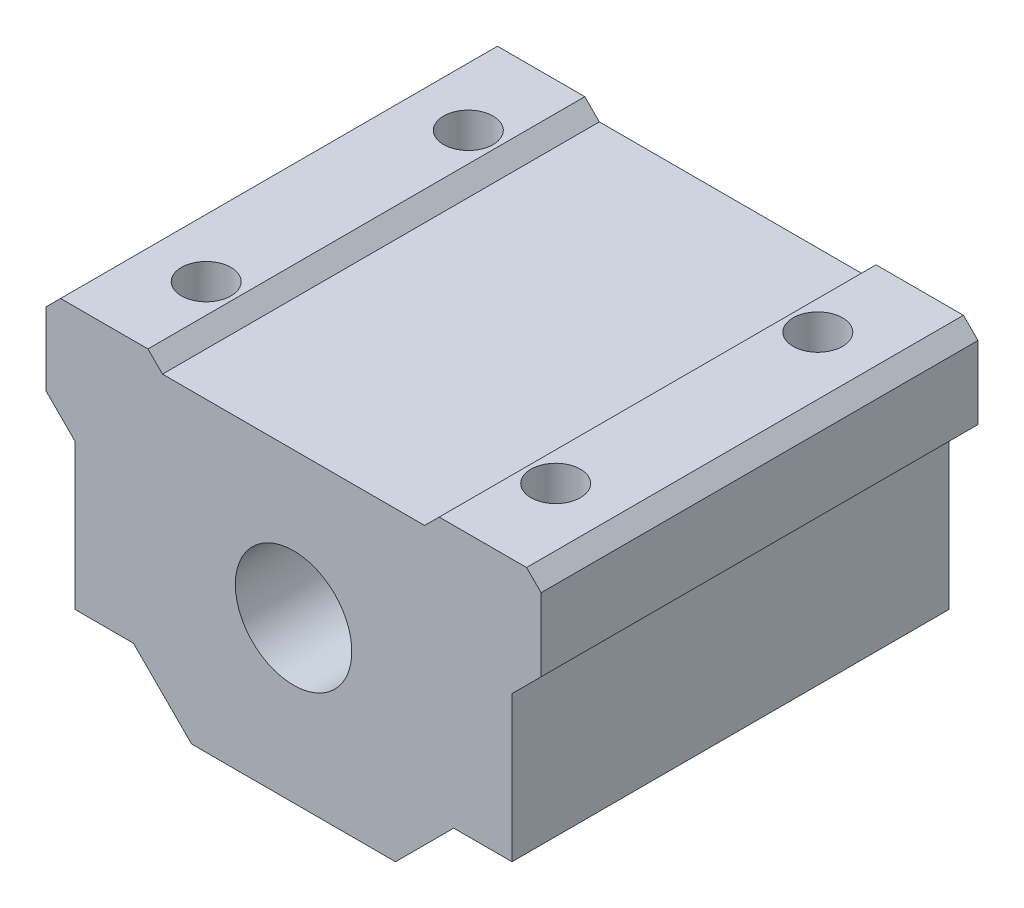
ISO-10303-21;
HEADER;
FILE_DESCRIPTION(('STEP AP214'),'2;1');
FILE_NAME('part.step','',(''),(''),'','','');
FILE_SCHEMA(('AUTOMOTIVE_DESIGN { 1 0 10303 214 1 1 1 1 }'));
ENDSEC;
DATA;
#1=APPLICATION_CONTEXT('core data for automotive mechanical design processes');
#2=APPLICATION_PROTOCOL_DEFINITION('international standard','automotive_design',2000,#1);
#3=PRODUCT_CONTEXT('',#1,'mechanical');
#4=PRODUCT('Part','Part','',(#3));
#5=PRODUCT_RELATED_PRODUCT_CATEGORY('part','',(#4));
#6=PRODUCT_DEFINITION_FORMATION('','',#4);
#7=PRODUCT_DEFINITION_CONTEXT('part definition',#1,'design');
#8=PRODUCT_DEFINITION('design','',#6,#7);
#9=PRODUCT_DEFINITION_SHAPE('','',#8);
#10=(LENGTH_UNIT() NAMED_UNIT(*) SI_UNIT(.MILLI.,.METRE.));
#11=(NAMED_UNIT(*) PLANE_ANGLE_UNIT() SI_UNIT($,.RADIAN.));
#12=(NAMED_UNIT(*) SI_UNIT($,.STERADIAN.) SOLID_ANGLE_UNIT());
#13=UNCERTAINTY_MEASURE_WITH_UNIT(LENGTH_MEASURE(1.E-05),#10,'distance_accuracy_value','');
#14=(GEOMETRIC_REPRESENTATION_CONTEXT(3) GLOBAL_UNCERTAINTY_ASSIGNED_CONTEXT((#13)) GLOBAL_UNIT_ASSIGNED_CONTEXT((#10,
#11,#12)) REPRESENTATION_CONTEXT('',''));
#15=CARTESIAN_POINT('',(0.,0.,0.));
#16=DIRECTION('',(0.,0.,1.));
#17=DIRECTION('',(1.,0.,0.));
#18=AXIS2_PLACEMENT_3D('',#15,#16,#17);
#19=CARTESIAN_POINT('',(0.,0.,30.));
#20=DIRECTION('',(0.,0.,1.));
#21=DIRECTION('',(1.,0.,0.));
#22=AXIS2_PLACEMENT_3D('',#19,#20,#21);
#23=PLANE('',#22);
#24=DIRECTION('',(0.707106781186548,0.707106781186549,0.));
#25=VECTOR('',#24,1.);
#26=CARTESIAN_POINT('',(6.99999999999992,0.,30.0000000000001));
#27=LINE('',#26,#25);
#28=CARTESIAN_POINT('',(6.99999999999992,0.,30.0000000000001));
#29=VERTEX_POINT('',#28);
#30=CARTESIAN_POINT('',(10.9999999999999,4.00000000000002,30.0000000000001));
#31=VERTEX_POINT('',#30);
#32=EDGE_CURVE('E247',#29,#31,#27,.T.);
#33=ORIENTED_EDGE('',*,*,#32,.T.);
#34=DIRECTION('',(1.,0.,0.));
#35=VECTOR('',#34,1.);
#36=CARTESIAN_POINT('',(10.9999999999999,4.00000000000002,30.0000000000001));
#37=LINE('',#36,#35);
#38=CARTESIAN_POINT('',(14.9999999999999,4.00000000000007,30.));
#39=VERTEX_POINT('',#38);
#40=EDGE_CURVE('E347',#31,#39,#37,.T.);
#41=ORIENTED_EDGE('',*,*,#40,.T.);
#42=DIRECTION('',(0.,1.,0.));
#43=VECTOR('',#42,1.);
#44=CARTESIAN_POINT('',(14.9999999999999,4.00000000000007,30.));
#45=LINE('',#44,#43);
#46=CARTESIAN_POINT('',(14.9999999999999,14.0000000000001,30.0000000000001));
#47=VERTEX_POINT('',#46);
#48=EDGE_CURVE('E344',#39,#47,#45,.T.);
#49=ORIENTED_EDGE('',*,*,#48,.T.);
#50=DIRECTION('',(0.70710678118655,0.707106781186546,0.));
#51=VECTOR('',#50,1.);
#52=CARTESIAN_POINT('',(14.9999999999999,14.0000000000001,30.0000000000001));
#53=LINE('',#52,#51);
#54=CARTESIAN_POINT('',(16.9999999999999,16.0000000000001,30.0000000000001));
#55=VERTEX_POINT('',#54);
#56=EDGE_CURVE('E341',#47,#55,#53,.T.);
#57=ORIENTED_EDGE('',*,*,#56,.T.);
#58=DIRECTION('',(0.,1.,0.));
#59=VECTOR('',#58,1.);
#60=CARTESIAN_POINT('',(16.9999999999999,16.0000000000001,30.0000000000001));
#61=LINE('',#60,#59);
#62=CARTESIAN_POINT('',(16.9999999999999,21.,30.0000000000001));
#63=VERTEX_POINT('',#62);
#64=EDGE_CURVE('E338',#55,#63,#61,.T.);
#65=ORIENTED_EDGE('',*,*,#64,.T.);
#66=DIRECTION('',(-0.707106781186549,0.707106781186548,0.));
#67=VECTOR('',#66,1.);
#68=CARTESIAN_POINT('',(16.9999999999999,21.,30.0000000000001));
#69=LINE('',#68,#67);
#70=CARTESIAN_POINT('',(15.9999999999999,22.,30.0000000000001));
#71=VERTEX_POINT('',#70);
#72=EDGE_CURVE('E335',#63,#71,#69,.T.);
#73=ORIENTED_EDGE('',*,*,#72,.T.);
#74=DIRECTION('',(-1.,0.,0.));
#75=VECTOR('',#74,1.);
#76=CARTESIAN_POINT('',(15.9999999999999,22.,30.0000000000001));
#77=LINE('',#76,#75);
#78=CARTESIAN_POINT('',(9.99999999999987,22.,30.0000000000001));
#79=VERTEX_POINT('',#78);
#80=EDGE_CURVE('E332',#71,#79,#77,.T.);
#81=ORIENTED_EDGE('',*,*,#80,.T.);
#82=DIRECTION('',(-0.707106781186544,-0.707106781186552,0.));
#83=VECTOR('',#82,1.);
#84=CARTESIAN_POINT('',(9.99999999999987,22.,30.0000000000001));
#85=LINE('',#84,#83);
#86=CARTESIAN_POINT('',(8.99999999999987,21.,30.0000000000001));
#87=VERTEX_POINT('',#86);
#88=EDGE_CURVE('E329',#79,#87,#85,.T.);
#89=ORIENTED_EDGE('',*,*,#88,.T.);
#90=DIRECTION('',(-1.,0.,0.));
#91=VECTOR('',#90,1.);
#92=CARTESIAN_POINT('',(8.99999999999987,21.,30.0000000000001));
#93=LINE('',#92,#91);
#94=CARTESIAN_POINT('',(-9.00000000000015,21.0000000000002,30.));
#95=VERTEX_POINT('',#94);
#96=EDGE_CURVE('E326',#87,#95,#93,.T.);
#97=ORIENTED_EDGE('',*,*,#96,.T.);
#98=DIRECTION('',(-0.707106781186547,0.70710678118655,0.));
#99=VECTOR('',#98,1.);
#100=CARTESIAN_POINT('',(-10.0000000000001,22.0000000000002,30.));
#101=LINE('',#100,#99);
#102=CARTESIAN_POINT('',(-10.0000000000001,22.0000000000002,30.));
#103=VERTEX_POINT('',#102);
#104=EDGE_CURVE('E323',#95,#103,#101,.T.);
#105=ORIENTED_EDGE('',*,*,#104,.T.);
#106=DIRECTION('',(-1.,0.,0.));
#107=VECTOR('',#106,1.);
#108=CARTESIAN_POINT('',(-16.0000000000002,22.0000000000002,30.));
#109=LINE('',#108,#107);
#110=CARTESIAN_POINT('',(-16.0000000000002,22.0000000000002,30.));
#111=VERTEX_POINT('',#110);
#112=EDGE_CURVE('E320',#103,#111,#109,.T.);
#113=ORIENTED_EDGE('',*,*,#112,.T.);
#114=DIRECTION('',(-0.707106781186549,-0.707106781186548,0.));
#115=VECTOR('',#114,1.);
#116=CARTESIAN_POINT('',(-17.0000000000002,21.0000000000002,30.));
#117=LINE('',#116,#115);
#118=CARTESIAN_POINT('',(-17.0000000000002,21.0000000000002,30.));
#119=VERTEX_POINT('',#118);
#120=EDGE_CURVE('E317',#111,#119,#117,.T.);
#121=ORIENTED_EDGE('',*,*,#120,.T.);
#122=DIRECTION('',(0.,-1.,0.));
#123=VECTOR('',#122,1.);
#124=CARTESIAN_POINT('',(-17.0000000000002,16.0000000000002,30.));
#125=LINE('',#124,#123);
#126=CARTESIAN_POINT('',(-17.0000000000002,16.0000000000002,30.));
#127=VERTEX_POINT('',#126);
#128=EDGE_CURVE('E314',#119,#127,#125,.T.);
#129=ORIENTED_EDGE('',*,*,#128,.T.);
#130=DIRECTION('',(0.70710678118655,-0.707106781186546,0.));
#131=VECTOR('',#130,1.);
#132=CARTESIAN_POINT('',(-15.0000000000001,14.0000000000002,30.));
#133=LINE('',#132,#131);
#134=CARTESIAN_POINT('',(-15.0000000000001,14.0000000000002,30.));
#135=VERTEX_POINT('',#134);
#136=EDGE_CURVE('E311',#127,#135,#133,.T.);
#137=ORIENTED_EDGE('',*,*,#136,.T.);
#138=DIRECTION('',(0.,-1.,0.));
#139=VECTOR('',#138,1.);
#140=CARTESIAN_POINT('',(-15.0000000000001,4.00000000000018,30.));
#141=LINE('',#140,#139);
#142=CARTESIAN_POINT('',(-15.0000000000001,4.00000000000018,30.));
#143=VERTEX_POINT('',#142);
#144=EDGE_CURVE('E308',#135,#143,#141,.T.);
#145=ORIENTED_EDGE('',*,*,#144,.T.);
#146=DIRECTION('',(1.,0.,0.));
#147=VECTOR('',#146,1.);
#148=CARTESIAN_POINT('',(-11.0000000000001,4.00000000000021,30.));
#149=LINE('',#148,#147);
#150=CARTESIAN_POINT('',(-11.0000000000001,4.00000000000021,30.));
#151=VERTEX_POINT('',#150);
#152=EDGE_CURVE('E305',#143,#151,#149,.T.);
#153=ORIENTED_EDGE('',*,*,#152,.T.);
#154=DIRECTION('',(0.707106781186548,-0.707106781186549,0.));
#155=VECTOR('',#154,1.);
#156=CARTESIAN_POINT('',(-7.00000000000009,0.,30.));
#157=LINE('',#156,#155);
#158=CARTESIAN_POINT('',(-7.00000000000009,0.,30.));
#159=VERTEX_POINT('',#158);
#160=EDGE_CURVE('E216',#151,#159,#157,.T.);
#161=ORIENTED_EDGE('',*,*,#160,.T.);
#162=DIRECTION('',(1.,0.,0.));
#163=VECTOR('',#162,1.);
#164=CARTESIAN_POINT('',(-7.00000000000009,0.,30.));
#165=LINE('',#164,#163);
#166=EDGE_CURVE('E241',#159,#29,#165,.T.);
#167=ORIENTED_EDGE('',*,*,#166,.T.);
#168=EDGE_LOOP('',(#33,#41,#49,#57,#65,#73,#81,#89,#97,#105,#113,#121,#129,#137,#145,#153,#161,#167));
#169=FACE_BOUND('',#168,.T.);
#170=CARTESIAN_POINT('',(0.,11.,30.));
#171=DIRECTION('',(0.,0.,1.));
#172=DIRECTION('',(-1.,0.,0.));
#173=AXIS2_PLACEMENT_3D('',#170,#171,#172);
#174=CIRCLE('',#173,4.);
#175=CARTESIAN_POINT('',(-4.0000000000001,11.,30.));
#176=VERTEX_POINT('',#175);
#177=EDGE_CURVE('E300',#176,#176,#174,.T.);
#178=ORIENTED_EDGE('',*,*,#177,.F.);
#179=EDGE_LOOP('',(#178));
#180=FACE_BOUND('',#179,.T.);
#181=ADVANCED_FACE('F40',(#169,#180),#23,.T.);
#182=CARTESIAN_POINT('',(0.,0.,0.));
#183=DIRECTION('',(0.,0.,1.));
#184=DIRECTION('',(1.,0.,0.));
#185=AXIS2_PLACEMENT_3D('',#182,#183,#184);
#186=PLANE('',#185);
#187=DIRECTION('',(0.707106781186548,0.707106781186549,0.));
#188=VECTOR('',#187,1.);
#189=CARTESIAN_POINT('',(7.00000000000001,0.,0.));
#190=LINE('',#189,#188);
#191=CARTESIAN_POINT('',(7.00000000000001,0.,0.));
#192=VERTEX_POINT('',#191);
#193=CARTESIAN_POINT('',(11.,4.,0.));
#194=VERTEX_POINT('',#193);
#195=EDGE_CURVE('E296',#192,#194,#190,.T.);
#196=ORIENTED_EDGE('',*,*,#195,.F.);
#197=DIRECTION('',(1.,0.,0.));
#198=VECTOR('',#197,1.);
#199=CARTESIAN_POINT('',(-7.00000000000001,0.,-1.11022302462516E-13));
#200=LINE('',#199,#198);
#201=CARTESIAN_POINT('',(-7.00000000000001,0.,-1.11022302462516E-13));
#202=VERTEX_POINT('',#201);
#203=EDGE_CURVE('E244',#202,#192,#200,.T.);
#204=ORIENTED_EDGE('',*,*,#203,.F.);
#205=DIRECTION('',(0.707106781186548,-0.707106781186549,0.));
#206=VECTOR('',#205,1.);
#207=CARTESIAN_POINT('',(-7.00000000000001,0.,-1.11022302462516E-13));
#208=LINE('',#207,#206);
#209=CARTESIAN_POINT('',(-11.,4.0000000000002,0.));
#210=VERTEX_POINT('',#209);
#211=EDGE_CURVE('E248',#210,#202,#208,.T.);
#212=ORIENTED_EDGE('',*,*,#211,.F.);
#213=DIRECTION('',(1.,0.,0.));
#214=VECTOR('',#213,1.);
#215=CARTESIAN_POINT('',(-11.,4.0000000000002,0.));
#216=LINE('',#215,#214);
#217=CARTESIAN_POINT('',(-15.,4.00000000000017,-1.11022302462516E-13));
#218=VERTEX_POINT('',#217);
#219=EDGE_CURVE('E251',#218,#210,#216,.T.);
#220=ORIENTED_EDGE('',*,*,#219,.F.);
#221=DIRECTION('',(0.,-1.,0.));
#222=VECTOR('',#221,1.);
#223=CARTESIAN_POINT('',(-15.,4.00000000000017,-1.11022302462516E-13));
#224=LINE('',#223,#222);
#225=CARTESIAN_POINT('',(-15.,14.0000000000002,-1.11022302462516E-13));
#226=VERTEX_POINT('',#225);
#227=EDGE_CURVE('E254',#226,#218,#224,.T.);
#228=ORIENTED_EDGE('',*,*,#227,.F.);
#229=DIRECTION('',(0.70710678118655,-0.707106781186546,0.));
#230=VECTOR('',#229,1.);
#231=CARTESIAN_POINT('',(-15.,14.0000000000002,-1.11022302462516E-13));
#232=LINE('',#231,#230);
#233=CARTESIAN_POINT('',(-17.0000000000002,16.0000000000002,-1.11022302462516E-13));
#234=VERTEX_POINT('',#233);
#235=EDGE_CURVE('E257',#234,#226,#232,.T.);
#236=ORIENTED_EDGE('',*,*,#235,.F.);
#237=DIRECTION('',(0.,-1.,0.));
#238=VECTOR('',#237,1.);
#239=CARTESIAN_POINT('',(-17.0000000000002,16.0000000000002,-1.11022302462516E-13));
#240=LINE('',#239,#238);
#241=CARTESIAN_POINT('',(-17.0000000000002,21.0000000000002,-1.11022302462516E-13));
#242=VERTEX_POINT('',#241);
#243=EDGE_CURVE('E260',#242,#234,#240,.T.);
#244=ORIENTED_EDGE('',*,*,#243,.F.);
#245=DIRECTION('',(-0.707106781186549,-0.707106781186548,0.));
#246=VECTOR('',#245,1.);
#247=CARTESIAN_POINT('',(-17.0000000000002,21.0000000000002,-1.11022302462516E-13));
#248=LINE('',#247,#246);
#249=CARTESIAN_POINT('',(-16.0000000000002,22.0000000000002,-1.11022302462516E-13));
#250=VERTEX_POINT('',#249);
#251=EDGE_CURVE('E263',#250,#242,#248,.T.);
#252=ORIENTED_EDGE('',*,*,#251,.F.);
#253=DIRECTION('',(-1.,0.,0.));
#254=VECTOR('',#253,1.);
#255=CARTESIAN_POINT('',(-16.0000000000002,22.0000000000002,-1.11022302462516E-13));
#256=LINE('',#255,#254);
#257=CARTESIAN_POINT('',(-10.0000000000001,22.0000000000002,0.));
#258=VERTEX_POINT('',#257);
#259=EDGE_CURVE('E266',#258,#250,#256,.T.);
#260=ORIENTED_EDGE('',*,*,#259,.F.);
#261=DIRECTION('',(-0.707106781186547,0.70710678118655,0.));
#262=VECTOR('',#261,1.);
#263=CARTESIAN_POINT('',(-10.0000000000001,22.0000000000002,0.));
#264=LINE('',#263,#262);
#265=CARTESIAN_POINT('',(-9.00000000000015,21.0000000000002,0.));
#266=VERTEX_POINT('',#265);
#267=EDGE_CURVE('E269',#266,#258,#264,.T.);
#268=ORIENTED_EDGE('',*,*,#267,.F.);
#269=DIRECTION('',(-1.,0.,0.));
#270=VECTOR('',#269,1.);
#271=CARTESIAN_POINT('',(8.99999999999993,21.,0.));
#272=LINE('',#271,#270);
#273=CARTESIAN_POINT('',(8.99999999999993,21.,0.));
#274=VERTEX_POINT('',#273);
#275=EDGE_CURVE('E272',#274,#266,#272,.T.);
#276=ORIENTED_EDGE('',*,*,#275,.F.);
#277=DIRECTION('',(-0.707106781186544,-0.707106781186552,0.));
#278=VECTOR('',#277,1.);
#279=CARTESIAN_POINT('',(9.99999999999993,22.,0.));
#280=LINE('',#279,#278);
#281=CARTESIAN_POINT('',(9.99999999999993,22.,0.));
#282=VERTEX_POINT('',#281);
#283=EDGE_CURVE('E275',#282,#274,#280,.T.);
#284=ORIENTED_EDGE('',*,*,#283,.F.);
#285=DIRECTION('',(-1.,0.,0.));
#286=VECTOR('',#285,1.);
#287=CARTESIAN_POINT('',(15.9999999999999,22.,0.));
#288=LINE('',#287,#286);
#289=CARTESIAN_POINT('',(15.9999999999999,22.,0.));
#290=VERTEX_POINT('',#289);
#291=EDGE_CURVE('E278',#290,#282,#288,.T.);
#292=ORIENTED_EDGE('',*,*,#291,.F.);
#293=DIRECTION('',(-0.707106781186549,0.707106781186548,0.));
#294=VECTOR('',#293,1.);
#295=CARTESIAN_POINT('',(17.,21.,1.11022302462516E-13));
#296=LINE('',#295,#294);
#297=CARTESIAN_POINT('',(17.,21.,1.11022302462516E-13));
#298=VERTEX_POINT('',#297);
#299=EDGE_CURVE('E281',#298,#290,#296,.T.);
#300=ORIENTED_EDGE('',*,*,#299,.F.);
#301=DIRECTION('',(0.,1.,0.));
#302=VECTOR('',#301,1.);
#303=CARTESIAN_POINT('',(16.9999999999999,16.,0.));
#304=LINE('',#303,#302);
#305=CARTESIAN_POINT('',(16.9999999999999,16.,0.));
#306=VERTEX_POINT('',#305);
#307=EDGE_CURVE('E284',#306,#298,#304,.T.);
#308=ORIENTED_EDGE('',*,*,#307,.F.);
#309=DIRECTION('',(0.70710678118655,0.707106781186546,0.));
#310=VECTOR('',#309,1.);
#311=CARTESIAN_POINT('',(14.9999999999999,14.,0.));
#312=LINE('',#311,#310);
#313=CARTESIAN_POINT('',(14.9999999999999,14.,0.));
#314=VERTEX_POINT('',#313);
#315=EDGE_CURVE('E287',#314,#306,#312,.T.);
#316=ORIENTED_EDGE('',*,*,#315,.F.);
#317=DIRECTION('',(0.,1.,0.));
#318=VECTOR('',#317,1.);
#319=CARTESIAN_POINT('',(15.,4.,0.));
#320=LINE('',#319,#318);
#321=CARTESIAN_POINT('',(15.,4.,0.));
#322=VERTEX_POINT('',#321);
#323=EDGE_CURVE('E290',#322,#314,#320,.T.);
#324=ORIENTED_EDGE('',*,*,#323,.F.);
#325=DIRECTION('',(1.,0.,0.));
#326=VECTOR('',#325,1.);
#327=CARTESIAN_POINT('',(11.,4.,0.));
#328=LINE('',#327,#326);
#329=EDGE_CURVE('E293',#194,#322,#328,.T.);
#330=ORIENTED_EDGE('',*,*,#329,.F.);
#331=EDGE_LOOP('',(#196,#204,#212,#220,#228,#236,#244,#252,#260,#268,#276,#284,#292,#300,#308,
#316,#324,#330));
#332=FACE_BOUND('',#331,.T.);
#333=CARTESIAN_POINT('',(0.,11.,0.));
#334=DIRECTION('',(0.,0.,1.));
#335=DIRECTION('',(-1.,0.,0.));
#336=AXIS2_PLACEMENT_3D('',#333,#334,#335);
#337=CIRCLE('',#336,4.);
#338=CARTESIAN_POINT('',(-4.00000000000001,11.,0.));
#339=VERTEX_POINT('',#338);
#340=EDGE_CURVE('E353',#339,#339,#337,.T.);
#341=ORIENTED_EDGE('',*,*,#340,.T.);
#342=EDGE_LOOP('',(#341));
#343=FACE_BOUND('',#342,.T.);
#344=ADVANCED_FACE('F400',(#332,#343),#186,.F.);
#345=CARTESIAN_POINT('',(6.99999999999992,0.,30.0000000000001));
#346=DIRECTION('',(-0.70710678118655,0.707106781186546,0.));
#347=DIRECTION('',(-0.707106781186548,-0.707106781186549,0.));
#348=AXIS2_PLACEMENT_3D('',#345,#346,#347);
#349=PLANE('',#348);
#350=DIRECTION('',(0.,0.,-1.));
#351=VECTOR('',#350,1.);
#352=CARTESIAN_POINT('',(10.9999999999999,4.00000000000002,30.0000000000001));
#353=LINE('',#352,#351);
#354=CARTESIAN_POINT('',(11.,4.,22.6252272915134));
#355=VERTEX_POINT('',#354);
#356=CARTESIAN_POINT('',(10.9999999999999,4.00000000000002,7.37477270848685));
#357=VERTEX_POINT('',#356);
#358=EDGE_CURVE('E481',#355,#357,#353,.T.);
#359=ORIENTED_EDGE('',*,*,#358,.F.);
#360=CARTESIAN_POINT('',(12.,5.00000000000003,24.0000000000001));
#361=DIRECTION('',(-0.70710678118655,0.707106781186546,0.));
#362=DIRECTION('',(0.707106781186548,0.707106781186549,0.));
#363=AXIS2_PLACEMENT_3D('',#360,#361,#362);
#364=ELLIPSE('',#363,2.40416305603427,1.7);
#365=CARTESIAN_POINT('',(11.,3.99999999999999,25.3747727084869));
#366=VERTEX_POINT('',#365);
#367=EDGE_CURVE('E64',#355,#366,#364,.T.);
#368=ORIENTED_EDGE('',*,*,#367,.T.);
#369=EDGE_CURVE('E200',#31,#366,#353,.T.);
#370=ORIENTED_EDGE('',*,*,#369,.F.);
#371=ORIENTED_EDGE('',*,*,#32,.F.);
#372=DIRECTION('',(0.,0.,-1.));
#373=VECTOR('',#372,1.);
#374=CARTESIAN_POINT('',(6.99999999999992,0.,30.0000000000001));
#375=LINE('',#374,#373);
#376=EDGE_CURVE('E234',#29,#192,#375,.T.);
#377=ORIENTED_EDGE('',*,*,#376,.T.);
#378=ORIENTED_EDGE('',*,*,#195,.T.);
#379=CARTESIAN_POINT('',(11.,3.99999999999999,4.62522729151327));
#380=VERTEX_POINT('',#379);
#381=EDGE_CURVE('E483',#380,#194,#353,.T.);
#382=ORIENTED_EDGE('',*,*,#381,.F.);
#383=CARTESIAN_POINT('',(11.9999999999999,5.00000000000003,6.00000000000012));
#384=DIRECTION('',(-0.70710678118655,0.707106781186546,0.));
#385=DIRECTION('',(0.707106781186548,0.707106781186549,0.));
#386=AXIS2_PLACEMENT_3D('',#383,#384,#385);
#387=ELLIPSE('',#386,2.40416305603427,1.7);
#388=EDGE_CURVE('E57',#380,#357,#387,.T.);
#389=ORIENTED_EDGE('',*,*,#388,.T.);
#390=EDGE_LOOP('',(#359,#368,#370,#371,#377,#378,#382,#389));
#391=FACE_BOUND('',#390,.T.);
#392=ADVANCED_FACE('F42',(#391),#349,.F.);
#393=CARTESIAN_POINT('',(10.9999999999999,4.00000000000002,30.0000000000001));
#394=DIRECTION('',(0.,1.,0.));
#395=DIRECTION('',(0.,0.,1.));
#396=AXIS2_PLACEMENT_3D('',#393,#394,#395);
#397=PLANE('',#396);
#398=ORIENTED_EDGE('',*,*,#369,.T.);
#399=CARTESIAN_POINT('',(12.,4.,24.0000000000001));
#400=DIRECTION('',(0.,1.,0.));
#401=DIRECTION('',(0.,0.,1.));
#402=AXIS2_PLACEMENT_3D('',#399,#400,#401);
#403=CIRCLE('',#402,1.7);
#404=EDGE_CURVE('E362',#366,#355,#403,.T.);
#405=ORIENTED_EDGE('',*,*,#404,.T.);
#406=ORIENTED_EDGE('',*,*,#358,.T.);
#407=CARTESIAN_POINT('',(12.,4.,6.00000000000001));
#408=DIRECTION('',(0.,1.,0.));
#409=DIRECTION('',(0.,0.,1.));
#410=AXIS2_PLACEMENT_3D('',#407,#408,#409);
#411=CIRCLE('',#410,1.7);
#412=EDGE_CURVE('E367',#357,#380,#411,.T.);
#413=ORIENTED_EDGE('',*,*,#412,.T.);
#414=ORIENTED_EDGE('',*,*,#381,.T.);
#415=ORIENTED_EDGE('',*,*,#329,.T.);
#416=DIRECTION('',(0.,0.,-1.));
#417=VECTOR('',#416,1.);
#418=CARTESIAN_POINT('',(14.9999999999999,4.00000000000007,30.));
#419=LINE('',#418,#417);
#420=EDGE_CURVE('E488',#39,#322,#419,.T.);
#421=ORIENTED_EDGE('',*,*,#420,.F.);
#422=ORIENTED_EDGE('',*,*,#40,.F.);
#423=EDGE_LOOP('',(#398,#405,#406,#413,#414,#415,#421,#422));
#424=FACE_BOUND('',#423,.T.);
#425=ADVANCED_FACE('F466',(#424),#397,.F.);
#426=CARTESIAN_POINT('',(14.9999999999999,4.00000000000007,30.));
#427=DIRECTION('',(-1.,0.,0.));
#428=DIRECTION('',(0.,-1.,0.));
#429=AXIS2_PLACEMENT_3D('',#426,#427,#428);
#430=PLANE('',#429);
#431=ORIENTED_EDGE('',*,*,#323,.T.);
#432=DIRECTION('',(0.,0.,-1.));
#433=VECTOR('',#432,1.);
#434=CARTESIAN_POINT('',(14.9999999999999,14.0000000000001,30.0000000000001));
#435=LINE('',#434,#433);
#436=EDGE_CURVE('E494',#47,#314,#435,.T.);
#437=ORIENTED_EDGE('',*,*,#436,.F.);
#438=ORIENTED_EDGE('',*,*,#48,.F.);
#439=ORIENTED_EDGE('',*,*,#420,.T.);
#440=EDGE_LOOP('',(#431,#437,#438,#439));
#441=FACE_BOUND('',#440,.T.);
#442=ADVANCED_FACE('F463',(#441),#430,.F.);
#443=CARTESIAN_POINT('',(14.9999999999999,14.0000000000001,30.0000000000001));
#444=DIRECTION('',(-0.707106781186548,0.707106781186549,0.));
#445=DIRECTION('',(-0.70710678118655,-0.707106781186546,0.));
#446=AXIS2_PLACEMENT_3D('',#443,#444,#445);
#447=PLANE('',#446);
#448=ORIENTED_EDGE('',*,*,#315,.T.);
#449=DIRECTION('',(0.,0.,-1.));
#450=VECTOR('',#449,1.);
#451=CARTESIAN_POINT('',(16.9999999999999,16.0000000000001,30.0000000000001));
#452=LINE('',#451,#450);
#453=EDGE_CURVE('E500',#55,#306,#452,.T.);
#454=ORIENTED_EDGE('',*,*,#453,.F.);
#455=ORIENTED_EDGE('',*,*,#56,.F.);
#456=ORIENTED_EDGE('',*,*,#436,.T.);
#457=EDGE_LOOP('',(#448,#454,#455,#456));
#458=FACE_BOUND('',#457,.T.);
#459=ADVANCED_FACE('F459',(#458),#447,.F.);
#460=CARTESIAN_POINT('',(16.9999999999999,16.0000000000001,30.0000000000001));
#461=DIRECTION('',(-1.,0.,0.));
#462=DIRECTION('',(0.,0.,1.));
#463=AXIS2_PLACEMENT_3D('',#460,#461,#462);
#464=PLANE('',#463);
#465=ORIENTED_EDGE('',*,*,#307,.T.);
#466=DIRECTION('',(0.,0.,-1.));
#467=VECTOR('',#466,1.);
#468=CARTESIAN_POINT('',(16.9999999999999,21.,30.0000000000001));
#469=LINE('',#468,#467);
#470=EDGE_CURVE('E506',#63,#298,#469,.T.);
#471=ORIENTED_EDGE('',*,*,#470,.F.);
#472=ORIENTED_EDGE('',*,*,#64,.F.);
#473=ORIENTED_EDGE('',*,*,#453,.T.);
#474=EDGE_LOOP('',(#465,#471,#472,#473));
#475=FACE_BOUND('',#474,.T.);
#476=ADVANCED_FACE('F455',(#475),#464,.F.);
#477=CARTESIAN_POINT('',(16.9999999999999,21.,30.0000000000001));
#478=DIRECTION('',(-0.707106781186549,-0.707106781186547,0.));
#479=DIRECTION('',(0.707106781186549,-0.707106781186548,0.));
#480=AXIS2_PLACEMENT_3D('',#477,#478,#479);
#481=PLANE('',#480);
#482=ORIENTED_EDGE('',*,*,#299,.T.);
#483=DIRECTION('',(0.,0.,-1.));
#484=VECTOR('',#483,1.);
#485=CARTESIAN_POINT('',(15.9999999999999,22.,30.0000000000001));
#486=LINE('',#485,#484);
#487=EDGE_CURVE('E510',#71,#290,#486,.T.);
#488=ORIENTED_EDGE('',*,*,#487,.F.);
#489=ORIENTED_EDGE('',*,*,#72,.F.);
#490=ORIENTED_EDGE('',*,*,#470,.T.);
#491=EDGE_LOOP('',(#482,#488,#489,#490));
#492=FACE_BOUND('',#491,.T.);
#493=ADVANCED_FACE('F451',(#492),#481,.F.);
#494=CARTESIAN_POINT('',(15.9999999999999,22.,30.0000000000001));
#495=DIRECTION('',(0.,-1.,0.));
#496=DIRECTION('',(1.,0.,0.));
#497=AXIS2_PLACEMENT_3D('',#494,#495,#496);
#498=PLANE('',#497);
#499=CARTESIAN_POINT('',(12.,22.,24.0000000000001));
#500=DIRECTION('',(0.,-1.,0.));
#501=DIRECTION('',(1.,0.,0.));
#502=AXIS2_PLACEMENT_3D('',#499,#500,#501);
#503=CIRCLE('',#502,1.7);
#504=CARTESIAN_POINT('',(13.7,22.,24.0000000000001));
#505=VERTEX_POINT('',#504);
#506=EDGE_CURVE('E44',#505,#505,#503,.T.);
#507=ORIENTED_EDGE('',*,*,#506,.T.);
#508=EDGE_LOOP('',(#507));
#509=FACE_BOUND('',#508,.T.);
#510=CARTESIAN_POINT('',(11.9999999999999,22.,6.00000000000001));
#511=DIRECTION('',(0.,-1.,0.));
#512=DIRECTION('',(1.,0.,0.));
#513=AXIS2_PLACEMENT_3D('',#510,#511,#512);
#514=CIRCLE('',#513,1.7);
#515=CARTESIAN_POINT('',(13.6999999999999,22.,6.00000000000001));
#516=VERTEX_POINT('',#515);
#517=EDGE_CURVE('E370',#516,#516,#514,.T.);
#518=ORIENTED_EDGE('',*,*,#517,.T.);
#519=EDGE_LOOP('',(#518));
#520=FACE_BOUND('',#519,.T.);
#521=ORIENTED_EDGE('',*,*,#291,.T.);
#522=DIRECTION('',(0.,0.,-1.));
#523=VECTOR('',#522,1.);
#524=CARTESIAN_POINT('',(9.99999999999987,22.,30.0000000000001));
#525=LINE('',#524,#523);
#526=EDGE_CURVE('E514',#79,#282,#525,.T.);
#527=ORIENTED_EDGE('',*,*,#526,.F.);
#528=ORIENTED_EDGE('',*,*,#80,.F.);
#529=ORIENTED_EDGE('',*,*,#487,.T.);
#530=EDGE_LOOP('',(#521,#527,#528,#529));
#531=FACE_BOUND('',#530,.T.);
#532=ADVANCED_FACE('F447',(#509,#520,#531),#498,.F.);
#533=CARTESIAN_POINT('',(9.99999999999987,22.,30.0000000000001));
#534=DIRECTION('',(0.707106781186554,-0.707106781186543,0.));
#535=DIRECTION('',(0.707106781186544,0.707106781186552,0.));
#536=AXIS2_PLACEMENT_3D('',#533,#534,#535);
#537=PLANE('',#536);
#538=ORIENTED_EDGE('',*,*,#283,.T.);
#539=DIRECTION('',(0.,0.,-1.));
#540=VECTOR('',#539,1.);
#541=CARTESIAN_POINT('',(8.99999999999987,21.,30.0000000000001));
#542=LINE('',#541,#540);
#543=EDGE_CURVE('E518',#87,#274,#542,.T.);
#544=ORIENTED_EDGE('',*,*,#543,.F.);
#545=ORIENTED_EDGE('',*,*,#88,.F.);
#546=ORIENTED_EDGE('',*,*,#526,.T.);
#547=EDGE_LOOP('',(#538,#544,#545,#546));
#548=FACE_BOUND('',#547,.T.);
#549=ADVANCED_FACE('F443',(#548),#537,.F.);
#550=CARTESIAN_POINT('',(8.99999999999987,21.,30.0000000000001));
#551=DIRECTION('',(0.,-1.,0.));
#552=DIRECTION('',(1.,0.,0.));
#553=AXIS2_PLACEMENT_3D('',#550,#551,#552);
#554=PLANE('',#553);
#555=ORIENTED_EDGE('',*,*,#275,.T.);
#556=DIRECTION('',(0.,0.,-1.));
#557=VECTOR('',#556,1.);
#558=CARTESIAN_POINT('',(-9.00000000000015,21.0000000000002,30.));
#559=LINE('',#558,#557);
#560=EDGE_CURVE('E522',#95,#266,#559,.T.);
#561=ORIENTED_EDGE('',*,*,#560,.F.);
#562=ORIENTED_EDGE('',*,*,#96,.F.);
#563=ORIENTED_EDGE('',*,*,#543,.T.);
#564=EDGE_LOOP('',(#555,#561,#562,#563));
#565=FACE_BOUND('',#564,.T.);
#566=ADVANCED_FACE('F439',(#565),#554,.F.);
#567=CARTESIAN_POINT('',(-10.0000000000001,22.0000000000002,30.));
#568=DIRECTION('',(-0.707106781186551,-0.707106781186545,0.));
#569=DIRECTION('',(0.707106781186547,-0.70710678118655,0.));
#570=AXIS2_PLACEMENT_3D('',#567,#568,#569);
#571=PLANE('',#570);
#572=ORIENTED_EDGE('',*,*,#267,.T.);
#573=DIRECTION('',(0.,0.,-1.));
#574=VECTOR('',#573,1.);
#575=CARTESIAN_POINT('',(-10.0000000000001,22.0000000000002,30.));
#576=LINE('',#575,#574);
#577=EDGE_CURVE('E526',#103,#258,#576,.T.);
#578=ORIENTED_EDGE('',*,*,#577,.F.);
#579=ORIENTED_EDGE('',*,*,#104,.F.);
#580=ORIENTED_EDGE('',*,*,#560,.T.);
#581=EDGE_LOOP('',(#572,#578,#579,#580));
#582=FACE_BOUND('',#581,.T.);
#583=ADVANCED_FACE('F435',(#582),#571,.F.);
#584=CARTESIAN_POINT('',(-16.0000000000002,22.0000000000002,30.));
#585=DIRECTION('',(0.,-1.,0.));
#586=DIRECTION('',(1.,0.,0.));
#587=AXIS2_PLACEMENT_3D('',#584,#585,#586);
#588=PLANE('',#587);
#589=CARTESIAN_POINT('',(-12.0000000000001,22.0000000000002,6.00000000000001));
#590=DIRECTION('',(0.,-1.,0.));
#591=DIRECTION('',(1.,0.,0.));
#592=AXIS2_PLACEMENT_3D('',#589,#590,#591);
#593=CIRCLE('',#592,1.7);
#594=CARTESIAN_POINT('',(-10.3000000000001,22.0000000000002,6.00000000000001));
#595=VERTEX_POINT('',#594);
#596=EDGE_CURVE('E371',#595,#595,#593,.T.);
#597=ORIENTED_EDGE('',*,*,#596,.T.);
#598=EDGE_LOOP('',(#597));
#599=FACE_BOUND('',#598,.T.);
#600=CARTESIAN_POINT('',(-12.0000000000001,22.0000000000002,24.));
#601=DIRECTION('',(0.,-1.,0.));
#602=DIRECTION('',(1.,0.,0.));
#603=AXIS2_PLACEMENT_3D('',#600,#601,#602);
#604=CIRCLE('',#603,1.7);
#605=CARTESIAN_POINT('',(-10.3000000000001,22.0000000000002,24.));
#606=VERTEX_POINT('',#605);
#607=EDGE_CURVE('E212',#606,#606,#604,.T.);
#608=ORIENTED_EDGE('',*,*,#607,.T.);
#609=EDGE_LOOP('',(#608));
#610=FACE_BOUND('',#609,.T.);
#611=ORIENTED_EDGE('',*,*,#259,.T.);
#612=DIRECTION('',(0.,0.,-1.));
#613=VECTOR('',#612,1.);
#614=CARTESIAN_POINT('',(-16.0000000000002,22.0000000000002,30.));
#615=LINE('',#614,#613);
#616=EDGE_CURVE('E530',#111,#250,#615,.T.);
#617=ORIENTED_EDGE('',*,*,#616,.F.);
#618=ORIENTED_EDGE('',*,*,#112,.F.);
#619=ORIENTED_EDGE('',*,*,#577,.T.);
#620=EDGE_LOOP('',(#611,#617,#618,#619));
#621=FACE_BOUND('',#620,.T.);
#622=ADVANCED_FACE('F383',(#599,#610,#621),#588,.F.);
#623=CARTESIAN_POINT('',(-17.0000000000002,21.0000000000002,30.));
#624=DIRECTION('',(0.707106781186549,-0.707106781186547,0.));
#625=DIRECTION('',(0.707106781186549,0.707106781186548,0.));
#626=AXIS2_PLACEMENT_3D('',#623,#624,#625);
#627=PLANE('',#626);
#628=ORIENTED_EDGE('',*,*,#251,.T.);
#629=DIRECTION('',(0.,0.,-1.));
#630=VECTOR('',#629,1.);
#631=CARTESIAN_POINT('',(-17.0000000000002,21.0000000000002,30.));
#632=LINE('',#631,#630);
#633=EDGE_CURVE('E534',#119,#242,#632,.T.);
#634=ORIENTED_EDGE('',*,*,#633,.F.);
#635=ORIENTED_EDGE('',*,*,#120,.F.);
#636=ORIENTED_EDGE('',*,*,#616,.T.);
#637=EDGE_LOOP('',(#628,#634,#635,#636));
#638=FACE_BOUND('',#637,.T.);
#639=ADVANCED_FACE('F428',(#638),#627,.F.);
#640=CARTESIAN_POINT('',(-17.0000000000002,16.0000000000002,30.));
#641=DIRECTION('',(1.,0.,0.));
#642=DIRECTION('',(0.,0.,-1.));
#643=AXIS2_PLACEMENT_3D('',#640,#641,#642);
#644=PLANE('',#643);
#645=ORIENTED_EDGE('',*,*,#243,.T.);
#646=DIRECTION('',(0.,0.,-1.));
#647=VECTOR('',#646,1.);
#648=CARTESIAN_POINT('',(-17.0000000000002,16.0000000000002,30.));
#649=LINE('',#648,#647);
#650=EDGE_CURVE('E538',#127,#234,#649,.T.);
#651=ORIENTED_EDGE('',*,*,#650,.F.);
#652=ORIENTED_EDGE('',*,*,#128,.F.);
#653=ORIENTED_EDGE('',*,*,#633,.T.);
#654=EDGE_LOOP('',(#645,#651,#652,#653));
#655=FACE_BOUND('',#654,.T.);
#656=ADVANCED_FACE('F424',(#655),#644,.F.);
#657=CARTESIAN_POINT('',(-15.0000000000001,14.0000000000002,30.));
#658=DIRECTION('',(0.707106781186548,0.707106781186549,0.));
#659=DIRECTION('',(-0.70710678118655,0.707106781186546,0.));
#660=AXIS2_PLACEMENT_3D('',#657,#658,#659);
#661=PLANE('',#660);
#662=ORIENTED_EDGE('',*,*,#235,.T.);
#663=DIRECTION('',(0.,0.,-1.));
#664=VECTOR('',#663,1.);
#665=CARTESIAN_POINT('',(-15.0000000000001,14.0000000000002,30.));
#666=LINE('',#665,#664);
#667=EDGE_CURVE('E225',#135,#226,#666,.T.);
#668=ORIENTED_EDGE('',*,*,#667,.F.);
#669=ORIENTED_EDGE('',*,*,#136,.F.);
#670=ORIENTED_EDGE('',*,*,#650,.T.);
#671=EDGE_LOOP('',(#662,#668,#669,#670));
#672=FACE_BOUND('',#671,.T.);
#673=ADVANCED_FACE('F420',(#672),#661,.F.);
#674=CARTESIAN_POINT('',(-15.0000000000001,4.00000000000018,30.));
#675=DIRECTION('',(1.,0.,0.));
#676=DIRECTION('',(0.,1.,0.));
#677=AXIS2_PLACEMENT_3D('',#674,#675,#676);
#678=PLANE('',#677);
#679=ORIENTED_EDGE('',*,*,#227,.T.);
#680=DIRECTION('',(0.,0.,-1.));
#681=VECTOR('',#680,1.);
#682=CARTESIAN_POINT('',(-15.0000000000001,4.00000000000018,30.));
#683=LINE('',#682,#681);
#684=EDGE_CURVE('E218',#143,#218,#683,.T.);
#685=ORIENTED_EDGE('',*,*,#684,.F.);
#686=ORIENTED_EDGE('',*,*,#144,.F.);
#687=ORIENTED_EDGE('',*,*,#667,.T.);
#688=EDGE_LOOP('',(#679,#685,#686,#687));
#689=FACE_BOUND('',#688,.T.);
#690=ADVANCED_FACE('F417',(#689),#678,.F.);
#691=CARTESIAN_POINT('',(-11.0000000000001,4.00000000000021,30.));
#692=DIRECTION('',(0.,1.,0.));
#693=DIRECTION('',(0.,0.,1.));
#694=AXIS2_PLACEMENT_3D('',#691,#692,#693);
#695=PLANE('',#694);
#696=DIRECTION('',(0.,0.,-1.));
#697=VECTOR('',#696,1.);
#698=CARTESIAN_POINT('',(-11.0000000000001,4.00000000000021,30.));
#699=LINE('',#698,#697);
#700=CARTESIAN_POINT('',(-11.0000000000001,4.00000000000021,4.62522729151327));
#701=VERTEX_POINT('',#700);
#702=EDGE_CURVE('E220',#701,#210,#699,.T.);
#703=ORIENTED_EDGE('',*,*,#702,.F.);
#704=CARTESIAN_POINT('',(-12.0000000000001,4.0000000000002,6.00000000000001));
#705=DIRECTION('',(0.,1.,0.));
#706=DIRECTION('',(0.,0.,1.));
#707=AXIS2_PLACEMENT_3D('',#704,#705,#706);
#708=CIRCLE('',#707,1.7);
#709=CARTESIAN_POINT('',(-11.0000000000001,4.00000000000021,7.37477270848674));
#710=VERTEX_POINT('',#709);
#711=EDGE_CURVE('E375',#701,#710,#708,.T.);
#712=ORIENTED_EDGE('',*,*,#711,.T.);
#713=CARTESIAN_POINT('',(-11.,4.0000000000002,22.6252272915133));
#714=VERTEX_POINT('',#713);
#715=EDGE_CURVE('E210',#714,#710,#699,.T.);
#716=ORIENTED_EDGE('',*,*,#715,.F.);
#717=CARTESIAN_POINT('',(-12.,4.00000000000021,24.));
#718=DIRECTION('',(0.,1.,0.));
#719=DIRECTION('',(0.,0.,1.));
#720=AXIS2_PLACEMENT_3D('',#717,#718,#719);
#721=CIRCLE('',#720,1.7);
#722=CARTESIAN_POINT('',(-11.,4.00000000000021,25.3747727084868));
#723=VERTEX_POINT('',#722);
#724=EDGE_CURVE('E194',#714,#723,#721,.T.);
#725=ORIENTED_EDGE('',*,*,#724,.T.);
#726=EDGE_CURVE('E207',#151,#723,#699,.T.);
#727=ORIENTED_EDGE('',*,*,#726,.F.);
#728=ORIENTED_EDGE('',*,*,#152,.F.);
#729=ORIENTED_EDGE('',*,*,#684,.T.);
#730=ORIENTED_EDGE('',*,*,#219,.T.);
#731=EDGE_LOOP('',(#703,#712,#716,#725,#727,#728,#729,#730));
#732=FACE_BOUND('',#731,.T.);
#733=ADVANCED_FACE('F205',(#732),#695,.F.);
#734=CARTESIAN_POINT('',(-7.00000000000009,0.,30.));
#735=DIRECTION('',(0.70710678118655,0.707106781186547,0.));
#736=DIRECTION('',(-0.707106781186548,0.707106781186549,0.));
#737=AXIS2_PLACEMENT_3D('',#734,#735,#736);
#738=PLANE('',#737);
#739=ORIENTED_EDGE('',*,*,#715,.T.);
#740=CARTESIAN_POINT('',(-12.0000000000001,5.0000000000002,6.00000000000001));
#741=DIRECTION('',(0.70710678118655,0.707106781186547,0.));
#742=DIRECTION('',(-0.707106781186548,0.707106781186549,0.));
#743=AXIS2_PLACEMENT_3D('',#740,#741,#742);
#744=ELLIPSE('',#743,2.40416305603426,1.7);
#745=EDGE_CURVE('E11',#710,#701,#744,.T.);
#746=ORIENTED_EDGE('',*,*,#745,.T.);
#747=ORIENTED_EDGE('',*,*,#702,.T.);
#748=ORIENTED_EDGE('',*,*,#211,.T.);
#749=DIRECTION('',(0.,0.,-1.));
#750=VECTOR('',#749,1.);
#751=CARTESIAN_POINT('',(-7.00000000000009,0.,30.));
#752=LINE('',#751,#750);
#753=EDGE_CURVE('E229',#159,#202,#752,.T.);
#754=ORIENTED_EDGE('',*,*,#753,.F.);
#755=ORIENTED_EDGE('',*,*,#160,.F.);
#756=ORIENTED_EDGE('',*,*,#726,.T.);
#757=CARTESIAN_POINT('',(-12.,5.00000000000021,24.));
#758=DIRECTION('',(0.70710678118655,0.707106781186547,0.));
#759=DIRECTION('',(-0.707106781186548,0.707106781186549,0.));
#760=AXIS2_PLACEMENT_3D('',#757,#758,#759);
#761=ELLIPSE('',#760,2.40416305603426,1.7);
#762=EDGE_CURVE('E50',#723,#714,#761,.T.);
#763=ORIENTED_EDGE('',*,*,#762,.T.);
#764=EDGE_LOOP('',(#739,#746,#747,#748,#754,#755,#756,#763));
#765=FACE_BOUND('',#764,.T.);
#766=ADVANCED_FACE('F214',(#765),#738,.F.);
#767=CARTESIAN_POINT('',(-7.00000000000009,0.,30.));
#768=DIRECTION('',(0.,1.,0.));
#769=DIRECTION('',(-1.,0.,0.));
#770=AXIS2_PLACEMENT_3D('',#767,#768,#769);
#771=PLANE('',#770);
#772=ORIENTED_EDGE('',*,*,#203,.T.);
#773=ORIENTED_EDGE('',*,*,#376,.F.);
#774=ORIENTED_EDGE('',*,*,#166,.F.);
#775=ORIENTED_EDGE('',*,*,#753,.T.);
#776=EDGE_LOOP('',(#772,#773,#774,#775));
#777=FACE_BOUND('',#776,.T.);
#778=ADVANCED_FACE('F396',(#777),#771,.F.);
#779=CARTESIAN_POINT('',(0.,11.,30.));
#780=DIRECTION('',(0.,0.,-1.));
#781=DIRECTION('',(-1.,0.,0.));
#782=AXIS2_PLACEMENT_3D('',#779,#780,#781);
#783=CYLINDRICAL_SURFACE('',#782,4.);
#784=ORIENTED_EDGE('',*,*,#177,.T.);
#785=EDGE_LOOP('',(#784));
#786=FACE_BOUND('',#785,.T.);
#787=ORIENTED_EDGE('',*,*,#340,.F.);
#788=EDGE_LOOP('',(#787));
#789=FACE_BOUND('',#788,.T.);
#790=ADVANCED_FACE('F387',(#786,#789),#783,.F.);
#791=CARTESIAN_POINT('',(-12.,2.08166817117217E-13,24.));
#792=DIRECTION('',(0.,1.,0.));
#793=DIRECTION('',(-1.,0.,0.));
#794=AXIS2_PLACEMENT_3D('',#791,#792,#793);
#795=CYLINDRICAL_SURFACE('',#794,1.7);
#796=ORIENTED_EDGE('',*,*,#762,.F.);
#797=ORIENTED_EDGE('',*,*,#724,.F.);
#798=EDGE_LOOP('',(#796,#797));
#799=FACE_BOUND('',#798,.T.);
#800=ORIENTED_EDGE('',*,*,#607,.F.);
#801=EDGE_LOOP('',(#800));
#802=FACE_BOUND('',#801,.T.);
#803=ADVANCED_FACE('F192',(#799,#802),#795,.F.);
#804=CARTESIAN_POINT('',(-12.0000000000001,1.94289029309402E-13,6.00000000000001));
#805=DIRECTION('',(0.,1.,0.));
#806=DIRECTION('',(-1.,0.,0.));
#807=AXIS2_PLACEMENT_3D('',#804,#805,#806);
#808=CYLINDRICAL_SURFACE('',#807,1.7);
#809=ORIENTED_EDGE('',*,*,#745,.F.);
#810=ORIENTED_EDGE('',*,*,#711,.F.);
#811=EDGE_LOOP('',(#809,#810));
#812=FACE_BOUND('',#811,.T.);
#813=ORIENTED_EDGE('',*,*,#596,.F.);
#814=EDGE_LOOP('',(#813));
#815=FACE_BOUND('',#814,.T.);
#816=ADVANCED_FACE('F386',(#812,#815),#808,.F.);
#817=CARTESIAN_POINT('',(12.,0.,6.00000000000001));
#818=DIRECTION('',(0.,1.,0.));
#819=DIRECTION('',(-1.,0.,0.));
#820=AXIS2_PLACEMENT_3D('',#817,#818,#819);
#821=CYLINDRICAL_SURFACE('',#820,1.7);
#822=ORIENTED_EDGE('',*,*,#517,.F.);
#823=EDGE_LOOP('',(#822));
#824=FACE_BOUND('',#823,.T.);
#825=ORIENTED_EDGE('',*,*,#412,.F.);
#826=ORIENTED_EDGE('',*,*,#388,.F.);
#827=EDGE_LOOP('',(#825,#826));
#828=FACE_BOUND('',#827,.T.);
#829=ADVANCED_FACE('F393',(#824,#828),#821,.F.);
#830=CARTESIAN_POINT('',(12.,0.,24.0000000000001));
#831=DIRECTION('',(0.,1.,0.));
#832=DIRECTION('',(-1.,0.,0.));
#833=AXIS2_PLACEMENT_3D('',#830,#831,#832);
#834=CYLINDRICAL_SURFACE('',#833,1.7);
#835=ORIENTED_EDGE('',*,*,#506,.F.);
#836=EDGE_LOOP('',(#835));
#837=FACE_BOUND('',#836,.T.);
#838=ORIENTED_EDGE('',*,*,#404,.F.);
#839=ORIENTED_EDGE('',*,*,#367,.F.);
#840=EDGE_LOOP('',(#838,#839));
#841=FACE_BOUND('',#840,.T.);
#842=ADVANCED_FACE('F589',(#837,#841),#834,.F.);
#843=CLOSED_SHELL('',(#181,#344,#392,#425,#442,#459,#476,#493,#532,#549,#566,#583,#622,#639,
#656,#673,#690,#733,#766,#778,#790,#803,#816,#829,#842));
#844=MANIFOLD_SOLID_BREP('B2',#843);
#845=ADVANCED_BREP_SHAPE_REPRESENTATION('',(#18,#844),#14);
#846=SHAPE_DEFINITION_REPRESENTATION(#9,#845);
ENDSEC;
END-ISO-10303-21;
